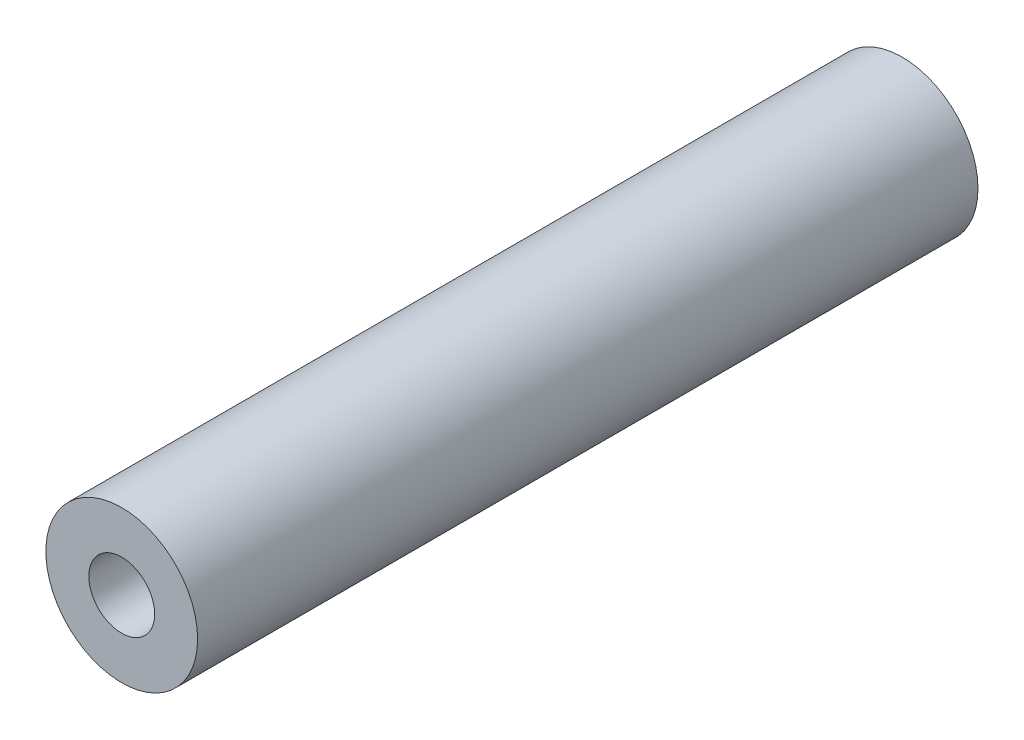
ISO-10303-21;
HEADER;
FILE_DESCRIPTION(('STEP AP214'),'2;1');
FILE_NAME('part.step','',(''),(''),'','','');
FILE_SCHEMA(('AUTOMOTIVE_DESIGN { 1 0 10303 214 1 1 1 1 }'));
ENDSEC;
DATA;
#1=APPLICATION_CONTEXT('core data for automotive mechanical design processes');
#2=APPLICATION_PROTOCOL_DEFINITION('international standard','automotive_design',2000,#1);
#3=PRODUCT_CONTEXT('',#1,'mechanical');
#4=PRODUCT('Part','Part','',(#3));
#5=PRODUCT_RELATED_PRODUCT_CATEGORY('part','',(#4));
#6=PRODUCT_DEFINITION_FORMATION('','',#4);
#7=PRODUCT_DEFINITION_CONTEXT('part definition',#1,'design');
#8=PRODUCT_DEFINITION('design','',#6,#7);
#9=PRODUCT_DEFINITION_SHAPE('','',#8);
#10=(LENGTH_UNIT() NAMED_UNIT(*) SI_UNIT(.MILLI.,.METRE.));
#11=(NAMED_UNIT(*) PLANE_ANGLE_UNIT() SI_UNIT($,.RADIAN.));
#12=(NAMED_UNIT(*) SI_UNIT($,.STERADIAN.) SOLID_ANGLE_UNIT());
#13=UNCERTAINTY_MEASURE_WITH_UNIT(LENGTH_MEASURE(1.E-05),#10,'distance_accuracy_value','');
#14=(GEOMETRIC_REPRESENTATION_CONTEXT(3) GLOBAL_UNCERTAINTY_ASSIGNED_CONTEXT((#13)) GLOBAL_UNIT_ASSIGNED_CONTEXT((#10,
#11,#12)) REPRESENTATION_CONTEXT('',''));
#15=CARTESIAN_POINT('',(0.,0.,0.));
#16=DIRECTION('',(0.,0.,1.));
#17=DIRECTION('',(1.,0.,0.));
#18=AXIS2_PLACEMENT_3D('',#15,#16,#17);
#19=CARTESIAN_POINT('',(0.,0.,36.));
#20=DIRECTION('',(0.,0.,-1.));
#21=DIRECTION('',(-1.,0.,0.));
#22=AXIS2_PLACEMENT_3D('',#19,#20,#21);
#23=CYLINDRICAL_SURFACE('',#22,3.5);
#24=CARTESIAN_POINT('',(0.,0.,36.));
#25=DIRECTION('',(0.,0.,1.));
#26=DIRECTION('',(1.,0.,0.));
#27=AXIS2_PLACEMENT_3D('',#24,#25,#26);
#28=CIRCLE('',#27,3.5);
#29=CARTESIAN_POINT('',(3.5,0.,36.));
#30=VERTEX_POINT('',#29);
#31=EDGE_CURVE('E10',#30,#30,#28,.T.);
#32=ORIENTED_EDGE('',*,*,#31,.F.);
#33=EDGE_LOOP('',(#32));
#34=FACE_BOUND('',#33,.T.);
#35=CARTESIAN_POINT('',(0.,0.,0.));
#36=DIRECTION('',(0.,0.,1.));
#37=DIRECTION('',(1.,0.,0.));
#38=AXIS2_PLACEMENT_3D('',#35,#36,#37);
#39=CIRCLE('',#38,3.5);
#40=CARTESIAN_POINT('',(3.5,0.,0.));
#41=VERTEX_POINT('',#40);
#42=EDGE_CURVE('E48',#41,#41,#39,.T.);
#43=ORIENTED_EDGE('',*,*,#42,.T.);
#44=EDGE_LOOP('',(#43));
#45=FACE_BOUND('',#44,.T.);
#46=ADVANCED_FACE('F41',(#34,#45),#23,.T.);
#47=CARTESIAN_POINT('',(0.,0.,36.));
#48=DIRECTION('',(0.,0.,1.));
#49=DIRECTION('',(1.,0.,0.));
#50=AXIS2_PLACEMENT_3D('',#47,#48,#49);
#51=PLANE('',#50);
#52=CARTESIAN_POINT('',(0.,0.,36.));
#53=DIRECTION('',(0.,0.,1.));
#54=DIRECTION('',(1.,0.,0.));
#55=AXIS2_PLACEMENT_3D('',#52,#53,#54);
#56=CIRCLE('',#55,1.52);
#57=CARTESIAN_POINT('',(1.52,0.,36.));
#58=VERTEX_POINT('',#57);
#59=EDGE_CURVE('E53',#58,#58,#56,.F.);
#60=ORIENTED_EDGE('',*,*,#59,.T.);
#61=EDGE_LOOP('',(#60));
#62=FACE_BOUND('',#61,.T.);
#63=ORIENTED_EDGE('',*,*,#31,.T.);
#64=EDGE_LOOP('',(#63));
#65=FACE_BOUND('',#64,.T.);
#66=ADVANCED_FACE('F66',(#62,#65),#51,.T.);
#67=CARTESIAN_POINT('',(0.,0.,0.));
#68=DIRECTION('',(0.,0.,1.));
#69=DIRECTION('',(1.,0.,0.));
#70=AXIS2_PLACEMENT_3D('',#67,#68,#69);
#71=PLANE('',#70);
#72=CARTESIAN_POINT('',(0.,0.,0.));
#73=DIRECTION('',(0.,0.,1.));
#74=DIRECTION('',(1.,0.,0.));
#75=AXIS2_PLACEMENT_3D('',#72,#73,#74);
#76=CIRCLE('',#75,1.52);
#77=CARTESIAN_POINT('',(1.52,0.,0.));
#78=VERTEX_POINT('',#77);
#79=EDGE_CURVE('E44',#78,#78,#76,.F.);
#80=ORIENTED_EDGE('',*,*,#79,.F.);
#81=EDGE_LOOP('',(#80));
#82=FACE_BOUND('',#81,.T.);
#83=ORIENTED_EDGE('',*,*,#42,.F.);
#84=EDGE_LOOP('',(#83));
#85=FACE_BOUND('',#84,.T.);
#86=ADVANCED_FACE('F63',(#82,#85),#71,.F.);
#87=CARTESIAN_POINT('',(0.,0.,37.));
#88=DIRECTION('',(0.,0.,-1.));
#89=DIRECTION('',(-1.,0.,0.));
#90=AXIS2_PLACEMENT_3D('',#87,#88,#89);
#91=CYLINDRICAL_SURFACE('',#90,1.52);
#92=ORIENTED_EDGE('',*,*,#59,.F.);
#93=EDGE_LOOP('',(#92));
#94=FACE_BOUND('',#93,.T.);
#95=ORIENTED_EDGE('',*,*,#79,.T.);
#96=EDGE_LOOP('',(#95));
#97=FACE_BOUND('',#96,.T.);
#98=ADVANCED_FACE('F61',(#94,#97),#91,.F.);
#99=CLOSED_SHELL('',(#46,#66,#86,#98));
#100=MANIFOLD_SOLID_BREP('B2',#99);
#101=ADVANCED_BREP_SHAPE_REPRESENTATION('',(#18,#100),#14);
#102=SHAPE_DEFINITION_REPRESENTATION(#9,#101);
ENDSEC;
END-ISO-10303-21;
